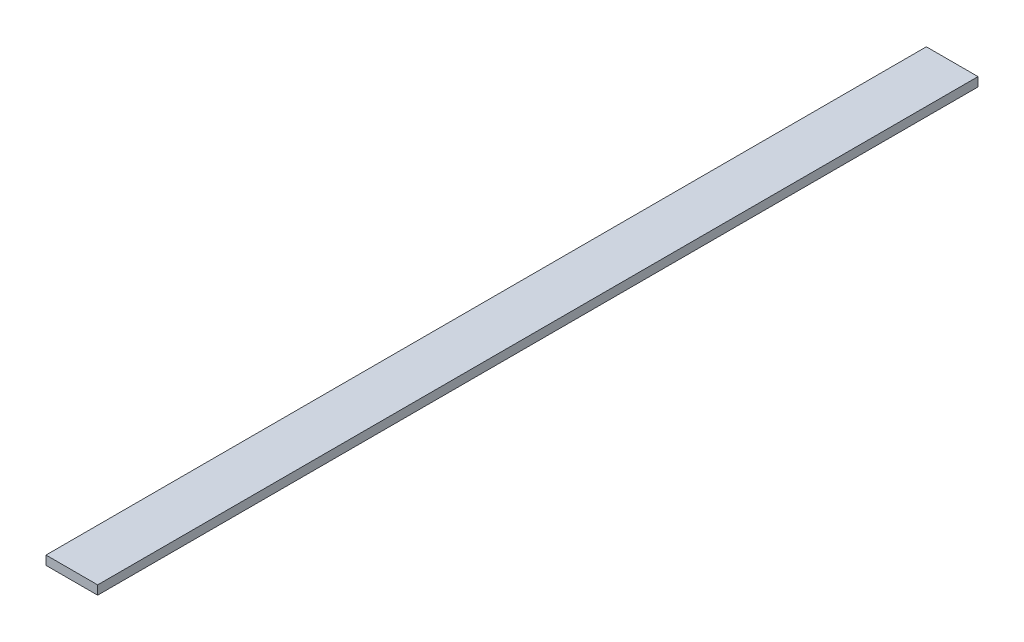
ISO-10303-21;
HEADER;
FILE_DESCRIPTION(('STEP AP214'),'2;1');
FILE_NAME('part.step','',(''),(''),'','','');
FILE_SCHEMA(('AUTOMOTIVE_DESIGN { 1 0 10303 214 1 1 1 1 }'));
ENDSEC;
DATA;
#1=APPLICATION_CONTEXT('core data for automotive mechanical design processes');
#2=APPLICATION_PROTOCOL_DEFINITION('international standard','automotive_design',2000,#1);
#3=PRODUCT_CONTEXT('',#1,'mechanical');
#4=PRODUCT('Part','Part','',(#3));
#5=PRODUCT_RELATED_PRODUCT_CATEGORY('part','',(#4));
#6=PRODUCT_DEFINITION_FORMATION('','',#4);
#7=PRODUCT_DEFINITION_CONTEXT('part definition',#1,'design');
#8=PRODUCT_DEFINITION('design','',#6,#7);
#9=PRODUCT_DEFINITION_SHAPE('','',#8);
#10=(LENGTH_UNIT() NAMED_UNIT(*) SI_UNIT(.MILLI.,.METRE.));
#11=(NAMED_UNIT(*) PLANE_ANGLE_UNIT() SI_UNIT($,.RADIAN.));
#12=(NAMED_UNIT(*) SI_UNIT($,.STERADIAN.) SOLID_ANGLE_UNIT());
#13=UNCERTAINTY_MEASURE_WITH_UNIT(LENGTH_MEASURE(1.E-05),#10,'distance_accuracy_value','');
#14=(GEOMETRIC_REPRESENTATION_CONTEXT(3) GLOBAL_UNCERTAINTY_ASSIGNED_CONTEXT((#13)) GLOBAL_UNIT_ASSIGNED_CONTEXT((#10,
#11,#12)) REPRESENTATION_CONTEXT('',''));
#15=CARTESIAN_POINT('',(0.,0.,0.));
#16=DIRECTION('',(0.,0.,1.));
#17=DIRECTION('',(1.,0.,0.));
#18=AXIS2_PLACEMENT_3D('',#15,#16,#17);
#19=CARTESIAN_POINT('',(-57.5,10.,1960.));
#20=DIRECTION('',(1.,0.,0.));
#21=DIRECTION('',(0.,0.,-1.));
#22=AXIS2_PLACEMENT_3D('',#19,#20,#21);
#23=PLANE('',#22);
#24=DIRECTION('',(0.,-1.,0.));
#25=VECTOR('',#24,1.);
#26=CARTESIAN_POINT('',(-57.5,10.,0.));
#27=LINE('',#26,#25);
#28=CARTESIAN_POINT('',(-57.5,10.,0.));
#29=VERTEX_POINT('',#28);
#30=CARTESIAN_POINT('',(-57.5,-10.,0.));
#31=VERTEX_POINT('',#30);
#32=EDGE_CURVE('E95',#29,#31,#27,.T.);
#33=ORIENTED_EDGE('',*,*,#32,.T.);
#34=DIRECTION('',(0.,0.,-1.));
#35=VECTOR('',#34,1.);
#36=CARTESIAN_POINT('',(-57.5,-10.,1960.));
#37=LINE('',#36,#35);
#38=CARTESIAN_POINT('',(-57.5,-10.,1960.));
#39=VERTEX_POINT('',#38);
#40=EDGE_CURVE('E11',#39,#31,#37,.T.);
#41=ORIENTED_EDGE('',*,*,#40,.F.);
#42=DIRECTION('',(0.,-1.,0.));
#43=VECTOR('',#42,1.);
#44=CARTESIAN_POINT('',(-57.5,10.,1960.));
#45=LINE('',#44,#43);
#46=CARTESIAN_POINT('',(-57.5,10.,1960.));
#47=VERTEX_POINT('',#46);
#48=EDGE_CURVE('E81',#47,#39,#45,.T.);
#49=ORIENTED_EDGE('',*,*,#48,.F.);
#50=DIRECTION('',(0.,0.,-1.));
#51=VECTOR('',#50,1.);
#52=CARTESIAN_POINT('',(-57.5,10.,1960.));
#53=LINE('',#52,#51);
#54=EDGE_CURVE('E48',#47,#29,#53,.T.);
#55=ORIENTED_EDGE('',*,*,#54,.T.);
#56=EDGE_LOOP('',(#33,#41,#49,#55));
#57=FACE_BOUND('',#56,.T.);
#58=ADVANCED_FACE('F32',(#57),#23,.F.);
#59=CARTESIAN_POINT('',(-57.5,-10.,1960.));
#60=DIRECTION('',(0.,1.,0.));
#61=DIRECTION('',(0.,0.,1.));
#62=AXIS2_PLACEMENT_3D('',#59,#60,#61);
#63=PLANE('',#62);
#64=DIRECTION('',(1.,0.,0.));
#65=VECTOR('',#64,1.);
#66=CARTESIAN_POINT('',(-57.5,-10.,0.));
#67=LINE('',#66,#65);
#68=CARTESIAN_POINT('',(57.5,-10.,0.));
#69=VERTEX_POINT('',#68);
#70=EDGE_CURVE('E86',#31,#69,#67,.T.);
#71=ORIENTED_EDGE('',*,*,#70,.T.);
#72=DIRECTION('',(0.,0.,-1.));
#73=VECTOR('',#72,1.);
#74=CARTESIAN_POINT('',(57.5,-10.,1960.));
#75=LINE('',#74,#73);
#76=CARTESIAN_POINT('',(57.5,-10.,1960.));
#77=VERTEX_POINT('',#76);
#78=EDGE_CURVE('E40',#77,#69,#75,.T.);
#79=ORIENTED_EDGE('',*,*,#78,.F.);
#80=DIRECTION('',(1.,0.,0.));
#81=VECTOR('',#80,1.);
#82=CARTESIAN_POINT('',(-57.5,-10.,1960.));
#83=LINE('',#82,#81);
#84=EDGE_CURVE('E73',#39,#77,#83,.T.);
#85=ORIENTED_EDGE('',*,*,#84,.F.);
#86=ORIENTED_EDGE('',*,*,#40,.T.);
#87=EDGE_LOOP('',(#71,#79,#85,#86));
#88=FACE_BOUND('',#87,.T.);
#89=ADVANCED_FACE('F85',(#88),#63,.F.);
#90=CARTESIAN_POINT('',(57.5,10.,1960.));
#91=DIRECTION('',(1.,0.,0.));
#92=DIRECTION('',(0.,0.,-1.));
#93=AXIS2_PLACEMENT_3D('',#90,#91,#92);
#94=PLANE('',#93);
#95=DIRECTION('',(0.,-1.,0.));
#96=VECTOR('',#95,1.);
#97=CARTESIAN_POINT('',(57.5,10.,0.));
#98=LINE('',#97,#96);
#99=CARTESIAN_POINT('',(57.5,10.,0.));
#100=VERTEX_POINT('',#99);
#101=EDGE_CURVE('E98',#100,#69,#98,.T.);
#102=ORIENTED_EDGE('',*,*,#101,.F.);
#103=DIRECTION('',(0.,0.,-1.));
#104=VECTOR('',#103,1.);
#105=CARTESIAN_POINT('',(57.5,10.,1960.));
#106=LINE('',#105,#104);
#107=CARTESIAN_POINT('',(57.5,10.,1960.));
#108=VERTEX_POINT('',#107);
#109=EDGE_CURVE('E62',#108,#100,#106,.T.);
#110=ORIENTED_EDGE('',*,*,#109,.F.);
#111=DIRECTION('',(0.,-1.,0.));
#112=VECTOR('',#111,1.);
#113=CARTESIAN_POINT('',(57.5,10.,1960.));
#114=LINE('',#113,#112);
#115=EDGE_CURVE('E80',#108,#77,#114,.T.);
#116=ORIENTED_EDGE('',*,*,#115,.T.);
#117=ORIENTED_EDGE('',*,*,#78,.T.);
#118=EDGE_LOOP('',(#102,#110,#116,#117));
#119=FACE_BOUND('',#118,.T.);
#120=ADVANCED_FACE('F89',(#119),#94,.T.);
#121=CARTESIAN_POINT('',(-57.5,10.,1960.));
#122=DIRECTION('',(0.,1.,0.));
#123=DIRECTION('',(0.,0.,1.));
#124=AXIS2_PLACEMENT_3D('',#121,#122,#123);
#125=PLANE('',#124);
#126=DIRECTION('',(1.,0.,0.));
#127=VECTOR('',#126,1.);
#128=CARTESIAN_POINT('',(-57.5,10.,0.));
#129=LINE('',#128,#127);
#130=EDGE_CURVE('E100',#29,#100,#129,.T.);
#131=ORIENTED_EDGE('',*,*,#130,.F.);
#132=ORIENTED_EDGE('',*,*,#54,.F.);
#133=DIRECTION('',(1.,0.,0.));
#134=VECTOR('',#133,1.);
#135=CARTESIAN_POINT('',(-57.5,10.,1960.));
#136=LINE('',#135,#134);
#137=EDGE_CURVE('E90',#47,#108,#136,.T.);
#138=ORIENTED_EDGE('',*,*,#137,.T.);
#139=ORIENTED_EDGE('',*,*,#109,.T.);
#140=EDGE_LOOP('',(#131,#132,#138,#139));
#141=FACE_BOUND('',#140,.T.);
#142=ADVANCED_FACE('F106',(#141),#125,.T.);
#143=CARTESIAN_POINT('',(0.,0.,1960.));
#144=DIRECTION('',(0.,0.,1.));
#145=DIRECTION('',(1.,0.,0.));
#146=AXIS2_PLACEMENT_3D('',#143,#144,#145);
#147=PLANE('',#146);
#148=ORIENTED_EDGE('',*,*,#48,.T.);
#149=ORIENTED_EDGE('',*,*,#84,.T.);
#150=ORIENTED_EDGE('',*,*,#115,.F.);
#151=ORIENTED_EDGE('',*,*,#137,.F.);
#152=EDGE_LOOP('',(#148,#149,#150,#151));
#153=FACE_BOUND('',#152,.T.);
#154=ADVANCED_FACE('F77',(#153),#147,.T.);
#155=CARTESIAN_POINT('',(0.,0.,0.));
#156=DIRECTION('',(0.,0.,1.));
#157=DIRECTION('',(1.,0.,0.));
#158=AXIS2_PLACEMENT_3D('',#155,#156,#157);
#159=PLANE('',#158);
#160=ORIENTED_EDGE('',*,*,#32,.F.);
#161=ORIENTED_EDGE('',*,*,#130,.T.);
#162=ORIENTED_EDGE('',*,*,#101,.T.);
#163=ORIENTED_EDGE('',*,*,#70,.F.);
#164=EDGE_LOOP('',(#160,#161,#162,#163));
#165=FACE_BOUND('',#164,.T.);
#166=ADVANCED_FACE('F105',(#165),#159,.F.);
#167=CLOSED_SHELL('',(#58,#89,#120,#142,#154,#166));
#168=MANIFOLD_SOLID_BREP('B2',#167);
#169=ADVANCED_BREP_SHAPE_REPRESENTATION('',(#18,#168),#14);
#170=SHAPE_DEFINITION_REPRESENTATION(#9,#169);
ENDSEC;
END-ISO-10303-21;
